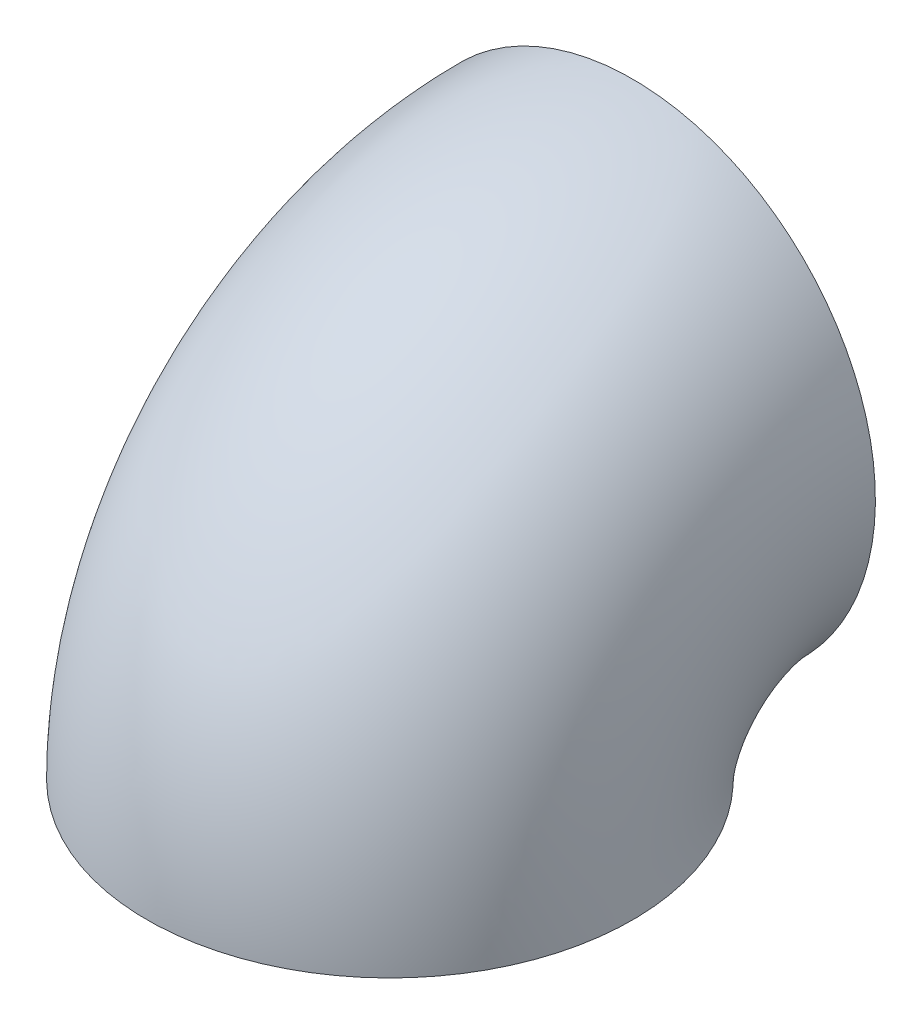
ISO-10303-21;
HEADER;
FILE_DESCRIPTION(('STEP AP214'),'2;1');
FILE_NAME('part.step','',(''),(''),'','','');
FILE_SCHEMA(('AUTOMOTIVE_DESIGN { 1 0 10303 214 1 1 1 1 }'));
ENDSEC;
DATA;
#1=APPLICATION_CONTEXT('core data for automotive mechanical design processes');
#2=APPLICATION_PROTOCOL_DEFINITION('international standard','automotive_design',2000,#1);
#3=PRODUCT_CONTEXT('',#1,'mechanical');
#4=PRODUCT('Part','Part','',(#3));
#5=PRODUCT_RELATED_PRODUCT_CATEGORY('part','',(#4));
#6=PRODUCT_DEFINITION_FORMATION('','',#4);
#7=PRODUCT_DEFINITION_CONTEXT('part definition',#1,'design');
#8=PRODUCT_DEFINITION('design','',#6,#7);
#9=PRODUCT_DEFINITION_SHAPE('','',#8);
#10=(LENGTH_UNIT() NAMED_UNIT(*) SI_UNIT(.MILLI.,.METRE.));
#11=(NAMED_UNIT(*) PLANE_ANGLE_UNIT() SI_UNIT($,.RADIAN.));
#12=(NAMED_UNIT(*) SI_UNIT($,.STERADIAN.) SOLID_ANGLE_UNIT());
#13=UNCERTAINTY_MEASURE_WITH_UNIT(LENGTH_MEASURE(1.E-05),#10,'distance_accuracy_value','');
#14=(GEOMETRIC_REPRESENTATION_CONTEXT(3) GLOBAL_UNCERTAINTY_ASSIGNED_CONTEXT((#13)) GLOBAL_UNIT_ASSIGNED_CONTEXT((#10,
#11,#12)) REPRESENTATION_CONTEXT('',''));
#15=CARTESIAN_POINT('',(0.,0.,0.));
#16=DIRECTION('',(0.,0.,1.));
#17=DIRECTION('',(1.,0.,0.));
#18=AXIS2_PLACEMENT_3D('',#15,#16,#17);
#19=CARTESIAN_POINT('',(0.,0.,-45.));
#20=DIRECTION('',(0.,-1.,0.));
#21=DIRECTION('',(0.,0.,-1.));
#22=AXIS2_PLACEMENT_3D('',#19,#20,#21);
#23=CIRCLE('',#22,45.);
#24=TRIMMED_CURVE('',#23,(PARAMETER_VALUE(-3.14159262378747)),
(PARAMETER_VALUE(3.14159262378747)),.T.,.PARAMETER.);
#25=CARTESIAN_POINT('',(0.,0.,0.));
#26=DIRECTION('',(1.,0.,0.));
#27=AXIS1_PLACEMENT('',#25,#26);
#28=SURFACE_OF_REVOLUTION('',#24,#27);
#29=CARTESIAN_POINT('',(0.,0.,45.));
#30=DIRECTION('',(0.,1.,0.));
#31=DIRECTION('',(0.,0.,1.));
#32=AXIS2_PLACEMENT_3D('',#29,#30,#31);
#33=CIRCLE('',#32,45.);
#34=CARTESIAN_POINT('',(0.,0.,0.));
#35=VERTEX_POINT('',#34);
#36=EDGE_CURVE('E53',#35,#35,#33,.T.);
#37=ORIENTED_EDGE('',*,*,#36,.T.);
#38=CARTESIAN_POINT('',(0.,45.,0.));
#39=DIRECTION('',(0.,0.,-1.));
#40=DIRECTION('',(0.,1.,0.));
#41=AXIS2_PLACEMENT_3D('',#38,#39,#40);
#42=CIRCLE('',#41,45.);
#43=EDGE_CURVE('E42',#35,#35,#42,.T.);
#44=ORIENTED_EDGE('',*,*,#43,.F.);
#45=EDGE_LOOP('',(#37,#44));
#46=FACE_BOUND('',#45,.T.);
#47=ADVANCED_FACE('F39',(#46),#28,.T.);
#48=CARTESIAN_POINT('',(0.,45.,0.));
#49=DIRECTION('',(0.,0.,-1.));
#50=DIRECTION('',(0.,1.,0.));
#51=AXIS2_PLACEMENT_3D('',#48,#49,#50);
#52=PLANE('',#51);
#53=CARTESIAN_POINT('',(0.,45.,0.));
#54=DIRECTION('',(0.,0.,-1.));
#55=DIRECTION('',(0.,1.,0.));
#56=AXIS2_PLACEMENT_3D('',#53,#54,#55);
#57=CIRCLE('',#56,10.);
#58=CARTESIAN_POINT('',(0.,55.,0.));
#59=VERTEX_POINT('',#58);
#60=EDGE_CURVE('E47',#59,#59,#57,.F.);
#61=ORIENTED_EDGE('',*,*,#60,.T.);
#62=EDGE_LOOP('',(#61));
#63=FACE_BOUND('',#62,.T.);
#64=ORIENTED_EDGE('',*,*,#43,.T.);
#65=EDGE_LOOP('',(#64));
#66=FACE_BOUND('',#65,.T.);
#67=ADVANCED_FACE('F58',(#63,#66),#52,.T.);
#68=CARTESIAN_POINT('',(0.,0.,45.));
#69=DIRECTION('',(0.,1.,0.));
#70=DIRECTION('',(0.,0.,1.));
#71=AXIS2_PLACEMENT_3D('',#68,#69,#70);
#72=PLANE('',#71);
#73=CARTESIAN_POINT('',(0.,0.,45.));
#74=DIRECTION('',(0.,1.,0.));
#75=DIRECTION('',(0.,0.,1.));
#76=AXIS2_PLACEMENT_3D('',#73,#74,#75);
#77=CIRCLE('',#76,10.);
#78=CARTESIAN_POINT('',(0.,0.,55.));
#79=VERTEX_POINT('',#78);
#80=EDGE_CURVE('E11',#79,#79,#77,.F.);
#81=ORIENTED_EDGE('',*,*,#80,.F.);
#82=EDGE_LOOP('',(#81));
#83=FACE_BOUND('',#82,.T.);
#84=ORIENTED_EDGE('',*,*,#36,.F.);
#85=EDGE_LOOP('',(#84));
#86=FACE_BOUND('',#85,.T.);
#87=ADVANCED_FACE('F68',(#83,#86),#72,.F.);
#88=CARTESIAN_POINT('',(0.,0.,0.));
#89=DIRECTION('',(1.,0.,0.));
#90=DIRECTION('',(0.,0.,-1.));
#91=AXIS2_PLACEMENT_3D('',#88,#89,#90);
#92=TOROIDAL_SURFACE('',#91,45.,10.);
#93=CARTESIAN_POINT('',(0.,0.,0.));
#94=DIRECTION('',(1.,0.,0.));
#95=DIRECTION('',(0.,0.,-1.));
#96=AXIS2_PLACEMENT_3D('',#93,#94,#95);
#97=CIRCLE('',#96,55.);
#98=EDGE_CURVE('',#59,#79,#97,.T.);
#99=ORIENTED_EDGE('',*,*,#60,.F.);
#100=ORIENTED_EDGE('',*,*,#80,.T.);
#101=ORIENTED_EDGE('',*,*,#98,.T.);
#102=ORIENTED_EDGE('',*,*,#98,.F.);
#103=EDGE_LOOP('',(#99,#101,#100,#102));
#104=FACE_BOUND('',#103,.T.);
#105=ADVANCED_FACE('F66',(#104),#92,.F.);
#106=CLOSED_SHELL('',(#47,#67,#87,#105));
#107=MANIFOLD_SOLID_BREP('B2',#106);
#108=ADVANCED_BREP_SHAPE_REPRESENTATION('',(#18,#107),#14);
#109=SHAPE_DEFINITION_REPRESENTATION(#9,#108);
ENDSEC;
END-ISO-10303-21;
